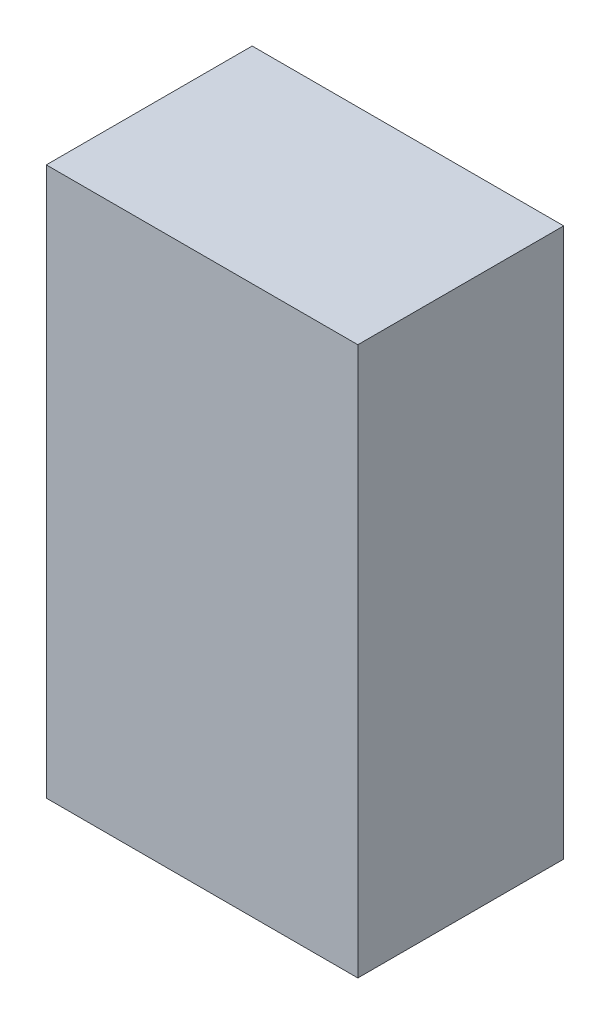
ISO-10303-21;
HEADER;
FILE_DESCRIPTION(('STEP AP214'),'2;1');
FILE_NAME('part.step','',(''),(''),'','','');
FILE_SCHEMA(('AUTOMOTIVE_DESIGN { 1 0 10303 214 1 1 1 1 }'));
ENDSEC;
DATA;
#1=APPLICATION_CONTEXT('core data for automotive mechanical design processes');
#2=APPLICATION_PROTOCOL_DEFINITION('international standard','automotive_design',2000,#1);
#3=PRODUCT_CONTEXT('',#1,'mechanical');
#4=PRODUCT('Part','Part','',(#3));
#5=PRODUCT_RELATED_PRODUCT_CATEGORY('part','',(#4));
#6=PRODUCT_DEFINITION_FORMATION('','',#4);
#7=PRODUCT_DEFINITION_CONTEXT('part definition',#1,'design');
#8=PRODUCT_DEFINITION('design','',#6,#7);
#9=PRODUCT_DEFINITION_SHAPE('','',#8);
#10=(LENGTH_UNIT() NAMED_UNIT(*) SI_UNIT(.MILLI.,.METRE.));
#11=(NAMED_UNIT(*) PLANE_ANGLE_UNIT() SI_UNIT($,.RADIAN.));
#12=(NAMED_UNIT(*) SI_UNIT($,.STERADIAN.) SOLID_ANGLE_UNIT());
#13=UNCERTAINTY_MEASURE_WITH_UNIT(LENGTH_MEASURE(1.E-05),#10,'distance_accuracy_value','');
#14=(GEOMETRIC_REPRESENTATION_CONTEXT(3) GLOBAL_UNCERTAINTY_ASSIGNED_CONTEXT((#13)) GLOBAL_UNIT_ASSIGNED_CONTEXT((#10,
#11,#12)) REPRESENTATION_CONTEXT('',''));
#15=CARTESIAN_POINT('',(0.,0.,0.));
#16=DIRECTION('',(0.,0.,1.));
#17=DIRECTION('',(1.,0.,0.));
#18=AXIS2_PLACEMENT_3D('',#15,#16,#17);
#19=CARTESIAN_POINT('',(0.,0.,0.));
#20=DIRECTION('',(0.,0.,1.));
#21=DIRECTION('',(1.,0.,0.));
#22=AXIS2_PLACEMENT_3D('',#19,#20,#21);
#23=PLANE('',#22);
#24=DIRECTION('',(0.,1.,0.));
#25=VECTOR('',#24,1.);
#26=CARTESIAN_POINT('',(6.8,-1.166112604551,0.));
#27=LINE('',#26,#25);
#28=CARTESIAN_POINT('',(6.8,2.83,0.));
#29=VERTEX_POINT('',#28);
#30=CARTESIAN_POINT('',(6.8,-1.166112604551,0.));
#31=VERTEX_POINT('',#30);
#32=EDGE_CURVE('E58',#29,#31,#27,.F.);
#33=ORIENTED_EDGE('',*,*,#32,.F.);
#34=DIRECTION('',(1.,0.,0.));
#35=VECTOR('',#34,1.);
#36=CARTESIAN_POINT('',(6.8,2.83,0.));
#37=LINE('',#36,#35);
#38=CARTESIAN_POINT('',(4.53,2.83,0.));
#39=VERTEX_POINT('',#38);
#40=EDGE_CURVE('E53',#39,#29,#37,.T.);
#41=ORIENTED_EDGE('',*,*,#40,.F.);
#42=DIRECTION('',(0.,1.,0.));
#43=VECTOR('',#42,1.);
#44=CARTESIAN_POINT('',(4.53,2.83,0.));
#45=LINE('',#44,#43);
#46=CARTESIAN_POINT('',(4.53,-1.166112604551,0.));
#47=VERTEX_POINT('',#46);
#48=EDGE_CURVE('E68',#47,#39,#45,.T.);
#49=ORIENTED_EDGE('',*,*,#48,.F.);
#50=DIRECTION('',(1.,0.,0.));
#51=VECTOR('',#50,1.);
#52=CARTESIAN_POINT('',(4.53,-1.166112604551,0.));
#53=LINE('',#52,#51);
#54=EDGE_CURVE('E20',#31,#47,#53,.F.);
#55=ORIENTED_EDGE('',*,*,#54,.F.);
#56=EDGE_LOOP('',(#33,#41,#49,#55));
#57=FACE_BOUND('',#56,.T.);
#58=ADVANCED_FACE('F17',(#57),#23,.T.);
#59=CARTESIAN_POINT('',(4.53,-1.166112604551,-1.5));
#60=DIRECTION('',(0.,-1.,0.));
#61=DIRECTION('',(0.,0.,-1.));
#62=AXIS2_PLACEMENT_3D('',#59,#60,#61);
#63=PLANE('',#62);
#64=DIRECTION('',(1.,0.,0.));
#65=VECTOR('',#64,1.);
#66=CARTESIAN_POINT('',(0.,-1.166112604551,-1.5));
#67=LINE('',#66,#65);
#68=CARTESIAN_POINT('',(4.53,-1.166112604551,-1.5));
#69=VERTEX_POINT('',#68);
#70=CARTESIAN_POINT('',(6.8,-1.166112604551,-1.5));
#71=VERTEX_POINT('',#70);
#72=EDGE_CURVE('E74',#69,#71,#67,.T.);
#73=ORIENTED_EDGE('',*,*,#72,.T.);
#74=DIRECTION('',(0.,0.,1.));
#75=VECTOR('',#74,1.);
#76=CARTESIAN_POINT('',(6.8,-1.166112604551,-1.5));
#77=LINE('',#76,#75);
#78=EDGE_CURVE('E63',#31,#71,#77,.F.);
#79=ORIENTED_EDGE('',*,*,#78,.F.);
#80=ORIENTED_EDGE('',*,*,#54,.T.);
#81=DIRECTION('',(0.,0.,1.));
#82=VECTOR('',#81,1.);
#83=CARTESIAN_POINT('',(4.53,-1.166112604551,-1.5));
#84=LINE('',#83,#82);
#85=EDGE_CURVE('E81',#69,#47,#84,.T.);
#86=ORIENTED_EDGE('',*,*,#85,.F.);
#87=EDGE_LOOP('',(#73,#79,#80,#86));
#88=FACE_BOUND('',#87,.T.);
#89=ADVANCED_FACE('F73',(#88),#63,.T.);
#90=CARTESIAN_POINT('',(6.8,-1.166112604551,-1.5));
#91=DIRECTION('',(1.,0.,0.));
#92=DIRECTION('',(0.,1.,0.));
#93=AXIS2_PLACEMENT_3D('',#90,#91,#92);
#94=PLANE('',#93);
#95=DIRECTION('',(0.,1.,0.));
#96=VECTOR('',#95,1.);
#97=CARTESIAN_POINT('',(6.8,0.,-1.5));
#98=LINE('',#97,#96);
#99=CARTESIAN_POINT('',(6.80000000000001,2.83,-1.5));
#100=VERTEX_POINT('',#99);
#101=EDGE_CURVE('E84',#71,#100,#98,.T.);
#102=ORIENTED_EDGE('',*,*,#101,.T.);
#103=DIRECTION('',(0.,0.,1.));
#104=VECTOR('',#103,1.);
#105=CARTESIAN_POINT('',(6.8,2.83,-1.5));
#106=LINE('',#105,#104);
#107=EDGE_CURVE('E65',#29,#100,#106,.F.);
#108=ORIENTED_EDGE('',*,*,#107,.F.);
#109=ORIENTED_EDGE('',*,*,#32,.T.);
#110=ORIENTED_EDGE('',*,*,#78,.T.);
#111=EDGE_LOOP('',(#102,#108,#109,#110));
#112=FACE_BOUND('',#111,.T.);
#113=ADVANCED_FACE('F61',(#112),#94,.T.);
#114=CARTESIAN_POINT('',(6.8,2.83,-1.5));
#115=DIRECTION('',(0.,1.,0.));
#116=DIRECTION('',(0.,0.,1.));
#117=AXIS2_PLACEMENT_3D('',#114,#115,#116);
#118=PLANE('',#117);
#119=DIRECTION('',(1.,0.,0.));
#120=VECTOR('',#119,1.);
#121=CARTESIAN_POINT('',(0.,2.83,-1.5));
#122=LINE('',#121,#120);
#123=CARTESIAN_POINT('',(4.53,2.83,-1.5));
#124=VERTEX_POINT('',#123);
#125=EDGE_CURVE('E26',#100,#124,#122,.F.);
#126=ORIENTED_EDGE('',*,*,#125,.T.);
#127=DIRECTION('',(0.,0.,1.));
#128=VECTOR('',#127,1.);
#129=CARTESIAN_POINT('',(4.53,2.83,-1.5));
#130=LINE('',#129,#128);
#131=EDGE_CURVE('E34',#39,#124,#130,.F.);
#132=ORIENTED_EDGE('',*,*,#131,.F.);
#133=ORIENTED_EDGE('',*,*,#40,.T.);
#134=ORIENTED_EDGE('',*,*,#107,.T.);
#135=EDGE_LOOP('',(#126,#132,#133,#134));
#136=FACE_BOUND('',#135,.T.);
#137=ADVANCED_FACE('F88',(#136),#118,.T.);
#138=CARTESIAN_POINT('',(4.53,2.83,-1.5));
#139=DIRECTION('',(-1.,0.,0.));
#140=DIRECTION('',(0.,0.,1.));
#141=AXIS2_PLACEMENT_3D('',#138,#139,#140);
#142=PLANE('',#141);
#143=DIRECTION('',(0.,1.,0.));
#144=VECTOR('',#143,1.);
#145=CARTESIAN_POINT('',(4.53,0.,-1.5));
#146=LINE('',#145,#144);
#147=EDGE_CURVE('E11',#124,#69,#146,.F.);
#148=ORIENTED_EDGE('',*,*,#147,.T.);
#149=ORIENTED_EDGE('',*,*,#85,.T.);
#150=ORIENTED_EDGE('',*,*,#48,.T.);
#151=ORIENTED_EDGE('',*,*,#131,.T.);
#152=EDGE_LOOP('',(#148,#149,#150,#151));
#153=FACE_BOUND('',#152,.T.);
#154=ADVANCED_FACE('F91',(#153),#142,.T.);
#155=CARTESIAN_POINT('',(0.,0.,-1.5));
#156=DIRECTION('',(0.,0.,1.));
#157=DIRECTION('',(1.,0.,0.));
#158=AXIS2_PLACEMENT_3D('',#155,#156,#157);
#159=PLANE('',#158);
#160=ORIENTED_EDGE('',*,*,#125,.F.);
#161=ORIENTED_EDGE('',*,*,#101,.F.);
#162=ORIENTED_EDGE('',*,*,#72,.F.);
#163=ORIENTED_EDGE('',*,*,#147,.F.);
#164=EDGE_LOOP('',(#160,#161,#162,#163));
#165=FACE_BOUND('',#164,.T.);
#166=ADVANCED_FACE('F90',(#165),#159,.F.);
#167=CLOSED_SHELL('',(#58,#89,#113,#137,#154,#166));
#168=MANIFOLD_SOLID_BREP('B1',#167);
#169=ADVANCED_BREP_SHAPE_REPRESENTATION('',(#18,#168),#14);
#170=SHAPE_DEFINITION_REPRESENTATION(#9,#169);
ENDSEC;
END-ISO-10303-21;
